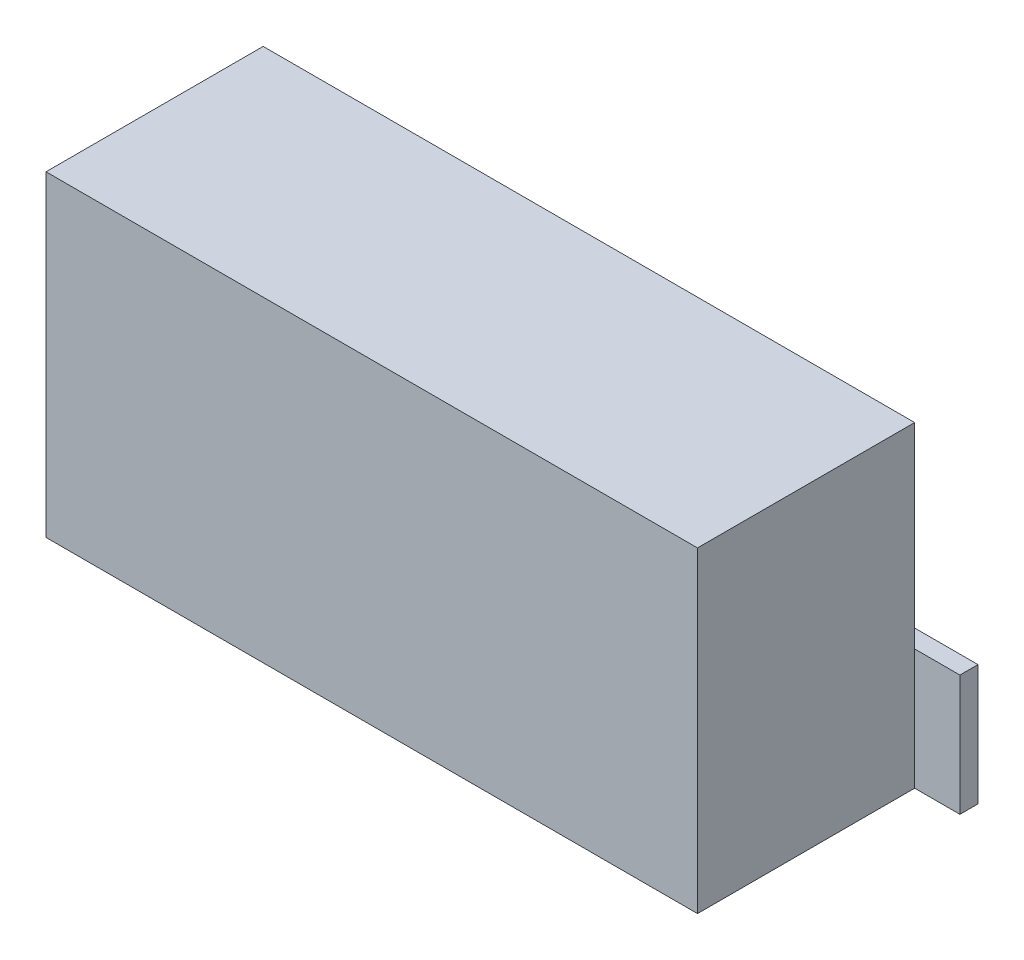
ISO-10303-21;
HEADER;
FILE_DESCRIPTION(('STEP AP214'),'2;1');
FILE_NAME('part.step','',(''),(''),'','','');
FILE_SCHEMA(('AUTOMOTIVE_DESIGN { 1 0 10303 214 1 1 1 1 }'));
ENDSEC;
DATA;
#1=APPLICATION_CONTEXT('core data for automotive mechanical design processes');
#2=APPLICATION_PROTOCOL_DEFINITION('international standard','automotive_design',2000,#1);
#3=PRODUCT_CONTEXT('',#1,'mechanical');
#4=PRODUCT('Part','Part','',(#3));
#5=PRODUCT_RELATED_PRODUCT_CATEGORY('part','',(#4));
#6=PRODUCT_DEFINITION_FORMATION('','',#4);
#7=PRODUCT_DEFINITION_CONTEXT('part definition',#1,'design');
#8=PRODUCT_DEFINITION('design','',#6,#7);
#9=PRODUCT_DEFINITION_SHAPE('','',#8);
#10=(LENGTH_UNIT() NAMED_UNIT(*) SI_UNIT(.MILLI.,.METRE.));
#11=(NAMED_UNIT(*) PLANE_ANGLE_UNIT() SI_UNIT($,.RADIAN.));
#12=(NAMED_UNIT(*) SI_UNIT($,.STERADIAN.) SOLID_ANGLE_UNIT());
#13=UNCERTAINTY_MEASURE_WITH_UNIT(LENGTH_MEASURE(1.E-05),#10,'distance_accuracy_value','');
#14=(GEOMETRIC_REPRESENTATION_CONTEXT(3) GLOBAL_UNCERTAINTY_ASSIGNED_CONTEXT((#13)) GLOBAL_UNIT_ASSIGNED_CONTEXT((#10,
#11,#12)) REPRESENTATION_CONTEXT('',''));
#15=CARTESIAN_POINT('',(0.,0.,0.));
#16=DIRECTION('',(0.,0.,1.));
#17=DIRECTION('',(1.,0.,0.));
#18=AXIS2_PLACEMENT_3D('',#15,#16,#17);
#19=CARTESIAN_POINT('',(-54.,52.5,-18.));
#20=DIRECTION('',(0.,0.,1.));
#21=DIRECTION('',(1.,0.,0.));
#22=AXIS2_PLACEMENT_3D('',#19,#20,#21);
#23=PLANE('',#22);
#24=DIRECTION('',(0.,1.,0.));
#25=VECTOR('',#24,1.);
#26=CARTESIAN_POINT('',(46.5,20.,-18.));
#27=LINE('',#26,#25);
#28=CARTESIAN_POINT('',(46.5,0.,-18.));
#29=VERTEX_POINT('',#28);
#30=CARTESIAN_POINT('',(46.5,20.,-18.));
#31=VERTEX_POINT('',#30);
#32=EDGE_CURVE('E59',#29,#31,#27,.T.);
#33=ORIENTED_EDGE('',*,*,#32,.F.);
#34=DIRECTION('',(-1.,0.,0.));
#35=VECTOR('',#34,1.);
#36=CARTESIAN_POINT('',(-54.,0.,-18.));
#37=LINE('',#36,#35);
#38=CARTESIAN_POINT('',(-54.,0.,-18.));
#39=VERTEX_POINT('',#38);
#40=EDGE_CURVE('E134',#29,#39,#37,.T.);
#41=ORIENTED_EDGE('',*,*,#40,.T.);
#42=DIRECTION('',(0.,-1.,0.));
#43=VECTOR('',#42,1.);
#44=CARTESIAN_POINT('',(-54.,52.5,-18.));
#45=LINE('',#44,#43);
#46=CARTESIAN_POINT('',(-54.,52.5,-18.));
#47=VERTEX_POINT('',#46);
#48=EDGE_CURVE('E168',#47,#39,#45,.T.);
#49=ORIENTED_EDGE('',*,*,#48,.F.);
#50=DIRECTION('',(-1.,0.,0.));
#51=VECTOR('',#50,1.);
#52=CARTESIAN_POINT('',(-54.,52.5,-18.));
#53=LINE('',#52,#51);
#54=CARTESIAN_POINT('',(54.,52.5,-18.));
#55=VERTEX_POINT('',#54);
#56=EDGE_CURVE('E144',#55,#47,#53,.T.);
#57=ORIENTED_EDGE('',*,*,#56,.F.);
#58=DIRECTION('',(0.,-1.,0.));
#59=VECTOR('',#58,1.);
#60=CARTESIAN_POINT('',(54.,52.5,-18.));
#61=LINE('',#60,#59);
#62=CARTESIAN_POINT('',(54.,20.,-18.));
#63=VERTEX_POINT('',#62);
#64=EDGE_CURVE('E11',#55,#63,#61,.T.);
#65=ORIENTED_EDGE('',*,*,#64,.T.);
#66=DIRECTION('',(1.,0.,0.));
#67=VECTOR('',#66,1.);
#68=CARTESIAN_POINT('',(61.5,20.,-18.));
#69=LINE('',#68,#67);
#70=EDGE_CURVE('E54',#31,#63,#69,.T.);
#71=ORIENTED_EDGE('',*,*,#70,.F.);
#72=EDGE_LOOP('',(#33,#41,#49,#57,#65,#71));
#73=FACE_BOUND('',#72,.T.);
#74=ADVANCED_FACE('F39',(#73),#23,.F.);
#75=CARTESIAN_POINT('',(54.,52.5,-18.));
#76=DIRECTION('',(-1.,0.,0.));
#77=DIRECTION('',(0.,0.,1.));
#78=AXIS2_PLACEMENT_3D('',#75,#76,#77);
#79=PLANE('',#78);
#80=DIRECTION('',(0.,0.,-1.));
#81=VECTOR('',#80,1.);
#82=CARTESIAN_POINT('',(54.,0.,-18.));
#83=LINE('',#82,#81);
#84=CARTESIAN_POINT('',(54.,0.,18.));
#85=VERTEX_POINT('',#84);
#86=CARTESIAN_POINT('',(54.,0.,-18.));
#87=VERTEX_POINT('',#86);
#88=EDGE_CURVE('E130',#85,#87,#83,.T.);
#89=ORIENTED_EDGE('',*,*,#88,.T.);
#90=EDGE_CURVE('E48',#63,#87,#61,.T.);
#91=ORIENTED_EDGE('',*,*,#90,.F.);
#92=ORIENTED_EDGE('',*,*,#64,.F.);
#93=DIRECTION('',(0.,0.,-1.));
#94=VECTOR('',#93,1.);
#95=CARTESIAN_POINT('',(54.,52.5,-18.));
#96=LINE('',#95,#94);
#97=CARTESIAN_POINT('',(54.,52.5,18.));
#98=VERTEX_POINT('',#97);
#99=EDGE_CURVE('E140',#98,#55,#96,.T.);
#100=ORIENTED_EDGE('',*,*,#99,.F.);
#101=DIRECTION('',(0.,-1.,0.));
#102=VECTOR('',#101,1.);
#103=CARTESIAN_POINT('',(54.,52.5,18.));
#104=LINE('',#103,#102);
#105=EDGE_CURVE('E153',#98,#85,#104,.T.);
#106=ORIENTED_EDGE('',*,*,#105,.T.);
#107=EDGE_LOOP('',(#89,#91,#92,#100,#106));
#108=FACE_BOUND('',#107,.T.);
#109=ADVANCED_FACE('F41',(#108),#79,.F.);
#110=CARTESIAN_POINT('',(-54.,52.5,-18.));
#111=DIRECTION('',(1.,0.,0.));
#112=DIRECTION('',(0.,0.,-1.));
#113=AXIS2_PLACEMENT_3D('',#110,#111,#112);
#114=PLANE('',#113);
#115=DIRECTION('',(0.,0.,1.));
#116=VECTOR('',#115,1.);
#117=CARTESIAN_POINT('',(-54.,0.,-18.));
#118=LINE('',#117,#116);
#119=CARTESIAN_POINT('',(-54.,0.,18.));
#120=VERTEX_POINT('',#119);
#121=EDGE_CURVE('E157',#39,#120,#118,.T.);
#122=ORIENTED_EDGE('',*,*,#121,.T.);
#123=DIRECTION('',(0.,-1.,0.));
#124=VECTOR('',#123,1.);
#125=CARTESIAN_POINT('',(-54.,52.5,18.));
#126=LINE('',#125,#124);
#127=CARTESIAN_POINT('',(-54.,52.5,18.));
#128=VERTEX_POINT('',#127);
#129=EDGE_CURVE('E165',#128,#120,#126,.T.);
#130=ORIENTED_EDGE('',*,*,#129,.F.);
#131=DIRECTION('',(0.,0.,1.));
#132=VECTOR('',#131,1.);
#133=CARTESIAN_POINT('',(-54.,52.5,-18.));
#134=LINE('',#133,#132);
#135=EDGE_CURVE('E148',#47,#128,#134,.T.);
#136=ORIENTED_EDGE('',*,*,#135,.F.);
#137=ORIENTED_EDGE('',*,*,#48,.T.);
#138=EDGE_LOOP('',(#122,#130,#136,#137));
#139=FACE_BOUND('',#138,.T.);
#140=ADVANCED_FACE('F214',(#139),#114,.F.);
#141=CARTESIAN_POINT('',(-54.,52.5,18.));
#142=DIRECTION('',(0.,0.,-1.));
#143=DIRECTION('',(-1.,0.,0.));
#144=AXIS2_PLACEMENT_3D('',#141,#142,#143);
#145=PLANE('',#144);
#146=DIRECTION('',(1.,0.,0.));
#147=VECTOR('',#146,1.);
#148=CARTESIAN_POINT('',(-54.,0.,18.));
#149=LINE('',#148,#147);
#150=EDGE_CURVE('E145',#120,#85,#149,.T.);
#151=ORIENTED_EDGE('',*,*,#150,.T.);
#152=ORIENTED_EDGE('',*,*,#105,.F.);
#153=DIRECTION('',(1.,0.,0.));
#154=VECTOR('',#153,1.);
#155=CARTESIAN_POINT('',(-54.,52.5,18.));
#156=LINE('',#155,#154);
#157=EDGE_CURVE('E151',#128,#98,#156,.T.);
#158=ORIENTED_EDGE('',*,*,#157,.F.);
#159=ORIENTED_EDGE('',*,*,#129,.T.);
#160=EDGE_LOOP('',(#151,#152,#158,#159));
#161=FACE_BOUND('',#160,.T.);
#162=ADVANCED_FACE('F225',(#161),#145,.F.);
#163=CARTESIAN_POINT('',(0.,52.5,0.));
#164=DIRECTION('',(0.,1.,0.));
#165=DIRECTION('',(0.,0.,1.));
#166=AXIS2_PLACEMENT_3D('',#163,#164,#165);
#167=PLANE('',#166);
#168=ORIENTED_EDGE('',*,*,#99,.T.);
#169=ORIENTED_EDGE('',*,*,#56,.T.);
#170=ORIENTED_EDGE('',*,*,#135,.T.);
#171=ORIENTED_EDGE('',*,*,#157,.T.);
#172=EDGE_LOOP('',(#168,#169,#170,#171));
#173=FACE_BOUND('',#172,.T.);
#174=ADVANCED_FACE('F217',(#173),#167,.T.);
#175=CARTESIAN_POINT('',(0.,0.,0.));
#176=DIRECTION('',(0.,1.,0.));
#177=DIRECTION('',(0.,0.,1.));
#178=AXIS2_PLACEMENT_3D('',#175,#176,#177);
#179=PLANE('',#178);
#180=ORIENTED_EDGE('',*,*,#88,.F.);
#181=ORIENTED_EDGE('',*,*,#150,.F.);
#182=ORIENTED_EDGE('',*,*,#121,.F.);
#183=ORIENTED_EDGE('',*,*,#40,.F.);
#184=DIRECTION('',(0.,0.,1.));
#185=VECTOR('',#184,1.);
#186=CARTESIAN_POINT('',(46.5,0.,-21.));
#187=LINE('',#186,#185);
#188=CARTESIAN_POINT('',(46.5,0.,-21.));
#189=VERTEX_POINT('',#188);
#190=EDGE_CURVE('E200',#189,#29,#187,.T.);
#191=ORIENTED_EDGE('',*,*,#190,.F.);
#192=DIRECTION('',(-1.,0.,0.));
#193=VECTOR('',#192,1.);
#194=CARTESIAN_POINT('',(61.5,0.,-21.));
#195=LINE('',#194,#193);
#196=CARTESIAN_POINT('',(61.5,0.,-21.));
#197=VERTEX_POINT('',#196);
#198=EDGE_CURVE('E121',#197,#189,#195,.T.);
#199=ORIENTED_EDGE('',*,*,#198,.F.);
#200=DIRECTION('',(0.,0.,1.));
#201=VECTOR('',#200,1.);
#202=CARTESIAN_POINT('',(61.5,0.,-21.));
#203=LINE('',#202,#201);
#204=CARTESIAN_POINT('',(61.5,0.,-18.));
#205=VERTEX_POINT('',#204);
#206=EDGE_CURVE('E136',#197,#205,#203,.T.);
#207=ORIENTED_EDGE('',*,*,#206,.T.);
#208=DIRECTION('',(-1.,0.,0.));
#209=VECTOR('',#208,1.);
#210=CARTESIAN_POINT('',(61.5,0.,-18.));
#211=LINE('',#210,#209);
#212=EDGE_CURVE('E126',#205,#87,#211,.T.);
#213=ORIENTED_EDGE('',*,*,#212,.T.);
#214=EDGE_LOOP('',(#180,#181,#182,#183,#191,#199,#207,#213));
#215=FACE_BOUND('',#214,.T.);
#216=ADVANCED_FACE('F190',(#215),#179,.F.);
#217=CARTESIAN_POINT('',(0.,0.,-18.));
#218=DIRECTION('',(0.,0.,-1.));
#219=DIRECTION('',(-1.,0.,0.));
#220=AXIS2_PLACEMENT_3D('',#217,#218,#219);
#221=PLANE('',#220);
#222=CARTESIAN_POINT('',(61.5,20.,-18.));
#223=VERTEX_POINT('',#222);
#224=EDGE_CURVE('E184',#63,#223,#69,.T.);
#225=ORIENTED_EDGE('',*,*,#224,.F.);
#226=ORIENTED_EDGE('',*,*,#90,.T.);
#227=ORIENTED_EDGE('',*,*,#212,.F.);
#228=DIRECTION('',(0.,-1.,0.));
#229=VECTOR('',#228,1.);
#230=CARTESIAN_POINT('',(61.5,20.,-18.));
#231=LINE('',#230,#229);
#232=EDGE_CURVE('E194',#223,#205,#231,.T.);
#233=ORIENTED_EDGE('',*,*,#232,.F.);
#234=EDGE_LOOP('',(#225,#226,#227,#233));
#235=FACE_BOUND('',#234,.T.);
#236=ADVANCED_FACE('F182',(#235),#221,.F.);
#237=CARTESIAN_POINT('',(46.5,20.,-21.));
#238=DIRECTION('',(1.,0.,0.));
#239=DIRECTION('',(0.,0.,-1.));
#240=AXIS2_PLACEMENT_3D('',#237,#238,#239);
#241=PLANE('',#240);
#242=ORIENTED_EDGE('',*,*,#32,.T.);
#243=DIRECTION('',(0.,0.,1.));
#244=VECTOR('',#243,1.);
#245=CARTESIAN_POINT('',(46.5,20.,-21.));
#246=LINE('',#245,#244);
#247=CARTESIAN_POINT('',(46.5,20.,-21.));
#248=VERTEX_POINT('',#247);
#249=EDGE_CURVE('E109',#248,#31,#246,.T.);
#250=ORIENTED_EDGE('',*,*,#249,.F.);
#251=DIRECTION('',(0.,1.,0.));
#252=VECTOR('',#251,1.);
#253=CARTESIAN_POINT('',(46.5,20.,-21.));
#254=LINE('',#253,#252);
#255=EDGE_CURVE('E116',#189,#248,#254,.T.);
#256=ORIENTED_EDGE('',*,*,#255,.F.);
#257=ORIENTED_EDGE('',*,*,#190,.T.);
#258=EDGE_LOOP('',(#242,#250,#256,#257));
#259=FACE_BOUND('',#258,.T.);
#260=ADVANCED_FACE('F128',(#259),#241,.F.);
#261=CARTESIAN_POINT('',(61.5,20.,-21.));
#262=DIRECTION('',(0.,-1.,0.));
#263=DIRECTION('',(0.,0.,-1.));
#264=AXIS2_PLACEMENT_3D('',#261,#262,#263);
#265=PLANE('',#264);
#266=ORIENTED_EDGE('',*,*,#70,.T.);
#267=ORIENTED_EDGE('',*,*,#224,.T.);
#268=DIRECTION('',(0.,0.,1.));
#269=VECTOR('',#268,1.);
#270=CARTESIAN_POINT('',(61.5,20.,-21.));
#271=LINE('',#270,#269);
#272=CARTESIAN_POINT('',(61.5,20.,-21.));
#273=VERTEX_POINT('',#272);
#274=EDGE_CURVE('E111',#273,#223,#271,.T.);
#275=ORIENTED_EDGE('',*,*,#274,.F.);
#276=DIRECTION('',(1.,0.,0.));
#277=VECTOR('',#276,1.);
#278=CARTESIAN_POINT('',(61.5,20.,-21.));
#279=LINE('',#278,#277);
#280=EDGE_CURVE('E105',#248,#273,#279,.T.);
#281=ORIENTED_EDGE('',*,*,#280,.F.);
#282=ORIENTED_EDGE('',*,*,#249,.T.);
#283=EDGE_LOOP('',(#266,#267,#275,#281,#282));
#284=FACE_BOUND('',#283,.T.);
#285=ADVANCED_FACE('F107',(#284),#265,.F.);
#286=CARTESIAN_POINT('',(61.5,20.,-21.));
#287=DIRECTION('',(-1.,0.,0.));
#288=DIRECTION('',(0.,0.,1.));
#289=AXIS2_PLACEMENT_3D('',#286,#287,#288);
#290=PLANE('',#289);
#291=ORIENTED_EDGE('',*,*,#232,.T.);
#292=ORIENTED_EDGE('',*,*,#206,.F.);
#293=DIRECTION('',(0.,-1.,0.));
#294=VECTOR('',#293,1.);
#295=CARTESIAN_POINT('',(61.5,20.,-21.));
#296=LINE('',#295,#294);
#297=EDGE_CURVE('E115',#273,#197,#296,.T.);
#298=ORIENTED_EDGE('',*,*,#297,.F.);
#299=ORIENTED_EDGE('',*,*,#274,.T.);
#300=EDGE_LOOP('',(#291,#292,#298,#299));
#301=FACE_BOUND('',#300,.T.);
#302=ADVANCED_FACE('F212',(#301),#290,.F.);
#303=CARTESIAN_POINT('',(0.,0.,-21.));
#304=DIRECTION('',(0.,0.,-1.));
#305=DIRECTION('',(-1.,0.,0.));
#306=AXIS2_PLACEMENT_3D('',#303,#304,#305);
#307=PLANE('',#306);
#308=ORIENTED_EDGE('',*,*,#255,.T.);
#309=ORIENTED_EDGE('',*,*,#280,.T.);
#310=ORIENTED_EDGE('',*,*,#297,.T.);
#311=ORIENTED_EDGE('',*,*,#198,.T.);
#312=EDGE_LOOP('',(#308,#309,#310,#311));
#313=FACE_BOUND('',#312,.T.);
#314=ADVANCED_FACE('F119',(#313),#307,.T.);
#315=CLOSED_SHELL('',(#74,#109,#140,#162,#174,#216,#236,#260,#285,#302,#314));
#316=MANIFOLD_SOLID_BREP('B2',#315);
#317=ADVANCED_BREP_SHAPE_REPRESENTATION('',(#18,#316),#14);
#318=SHAPE_DEFINITION_REPRESENTATION(#9,#317);
ENDSEC;
END-ISO-10303-21;
